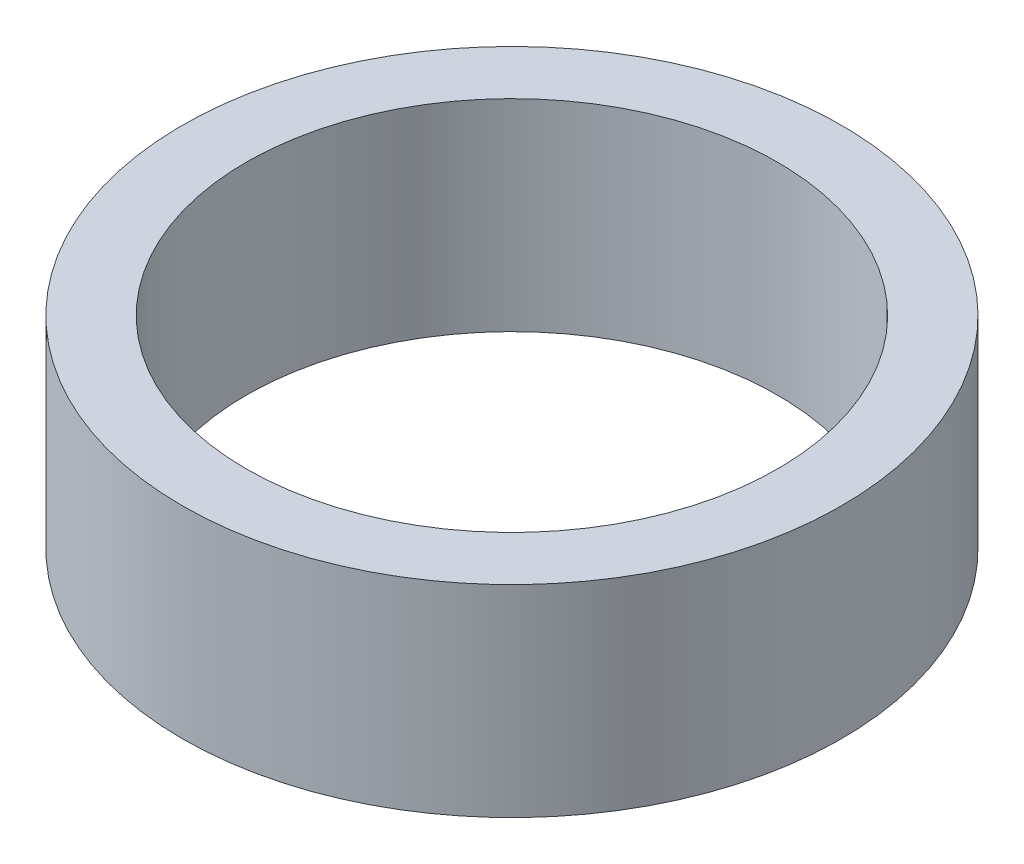
ISO-10303-21;
HEADER;
FILE_DESCRIPTION(('STEP AP214'),'2;1');
FILE_NAME('part.step','',(''),(''),'','','');
FILE_SCHEMA(('AUTOMOTIVE_DESIGN { 1 0 10303 214 1 1 1 1 }'));
ENDSEC;
DATA;
#1=APPLICATION_CONTEXT('core data for automotive mechanical design processes');
#2=APPLICATION_PROTOCOL_DEFINITION('international standard','automotive_design',2000,#1);
#3=PRODUCT_CONTEXT('',#1,'mechanical');
#4=PRODUCT('Part','Part','',(#3));
#5=PRODUCT_RELATED_PRODUCT_CATEGORY('part','',(#4));
#6=PRODUCT_DEFINITION_FORMATION('','',#4);
#7=PRODUCT_DEFINITION_CONTEXT('part definition',#1,'design');
#8=PRODUCT_DEFINITION('design','',#6,#7);
#9=PRODUCT_DEFINITION_SHAPE('','',#8);
#10=(LENGTH_UNIT() NAMED_UNIT(*) SI_UNIT(.MILLI.,.METRE.));
#11=(NAMED_UNIT(*) PLANE_ANGLE_UNIT() SI_UNIT($,.RADIAN.));
#12=(NAMED_UNIT(*) SI_UNIT($,.STERADIAN.) SOLID_ANGLE_UNIT());
#13=UNCERTAINTY_MEASURE_WITH_UNIT(LENGTH_MEASURE(1.E-05),#10,'distance_accuracy_value','');
#14=(GEOMETRIC_REPRESENTATION_CONTEXT(3) GLOBAL_UNCERTAINTY_ASSIGNED_CONTEXT((#13)) GLOBAL_UNIT_ASSIGNED_CONTEXT((#10,
#11,#12)) REPRESENTATION_CONTEXT('',''));
#15=CARTESIAN_POINT('',(0.,0.,0.));
#16=DIRECTION('',(0.,0.,1.));
#17=DIRECTION('',(1.,0.,0.));
#18=AXIS2_PLACEMENT_3D('',#15,#16,#17);
#19=CARTESIAN_POINT('',(0.,3.,0.));
#20=DIRECTION('',(0.,1.,0.));
#21=DIRECTION('',(0.,0.,1.));
#22=AXIS2_PLACEMENT_3D('',#19,#20,#21);
#23=PLANE('',#22);
#24=CARTESIAN_POINT('',(0.,3.,0.));
#25=DIRECTION('',(0.,1.,0.));
#26=DIRECTION('',(0.,0.,1.));
#27=AXIS2_PLACEMENT_3D('',#24,#25,#26);
#28=CIRCLE('',#27,4.9);
#29=CARTESIAN_POINT('',(0.,3.,4.9));
#30=VERTEX_POINT('',#29);
#31=EDGE_CURVE('E10',#30,#30,#28,.T.);
#32=ORIENTED_EDGE('',*,*,#31,.T.);
#33=EDGE_LOOP('',(#32));
#34=FACE_BOUND('',#33,.T.);
#35=CARTESIAN_POINT('',(0.,3.,0.));
#36=DIRECTION('',(0.,1.,0.));
#37=DIRECTION('',(0.,0.,1.));
#38=AXIS2_PLACEMENT_3D('',#35,#36,#37);
#39=CIRCLE('',#38,3.95);
#40=CARTESIAN_POINT('',(0.,3.,3.95));
#41=VERTEX_POINT('',#40);
#42=EDGE_CURVE('E54',#41,#41,#39,.T.);
#43=ORIENTED_EDGE('',*,*,#42,.F.);
#44=EDGE_LOOP('',(#43));
#45=FACE_BOUND('',#44,.T.);
#46=ADVANCED_FACE('F41',(#34,#45),#23,.T.);
#47=CARTESIAN_POINT('',(0.,0.,0.));
#48=DIRECTION('',(0.,1.,0.));
#49=DIRECTION('',(0.,0.,1.));
#50=AXIS2_PLACEMENT_3D('',#47,#48,#49);
#51=PLANE('',#50);
#52=CARTESIAN_POINT('',(0.,0.,0.));
#53=DIRECTION('',(0.,1.,0.));
#54=DIRECTION('',(0.,0.,1.));
#55=AXIS2_PLACEMENT_3D('',#52,#53,#54);
#56=CIRCLE('',#55,4.9);
#57=CARTESIAN_POINT('',(0.,0.,4.9));
#58=VERTEX_POINT('',#57);
#59=EDGE_CURVE('E45',#58,#58,#56,.T.);
#60=ORIENTED_EDGE('',*,*,#59,.F.);
#61=EDGE_LOOP('',(#60));
#62=FACE_BOUND('',#61,.T.);
#63=CARTESIAN_POINT('',(0.,0.,0.));
#64=DIRECTION('',(0.,1.,0.));
#65=DIRECTION('',(0.,0.,1.));
#66=AXIS2_PLACEMENT_3D('',#63,#64,#65);
#67=CIRCLE('',#66,3.95);
#68=CARTESIAN_POINT('',(0.,0.,3.95));
#69=VERTEX_POINT('',#68);
#70=EDGE_CURVE('E56',#69,#69,#67,.T.);
#71=ORIENTED_EDGE('',*,*,#70,.T.);
#72=EDGE_LOOP('',(#71));
#73=FACE_BOUND('',#72,.T.);
#74=ADVANCED_FACE('F68',(#62,#73),#51,.F.);
#75=CARTESIAN_POINT('',(0.,3.,0.));
#76=DIRECTION('',(0.,-1.,0.));
#77=DIRECTION('',(0.,0.,-1.));
#78=AXIS2_PLACEMENT_3D('',#75,#76,#77);
#79=CYLINDRICAL_SURFACE('',#78,4.9);
#80=ORIENTED_EDGE('',*,*,#31,.F.);
#81=EDGE_LOOP('',(#80));
#82=FACE_BOUND('',#81,.T.);
#83=ORIENTED_EDGE('',*,*,#59,.T.);
#84=EDGE_LOOP('',(#83));
#85=FACE_BOUND('',#84,.T.);
#86=ADVANCED_FACE('F43',(#82,#85),#79,.T.);
#87=CARTESIAN_POINT('',(0.,3.,0.));
#88=DIRECTION('',(0.,-1.,0.));
#89=DIRECTION('',(0.,0.,-1.));
#90=AXIS2_PLACEMENT_3D('',#87,#88,#89);
#91=CYLINDRICAL_SURFACE('',#90,3.95);
#92=ORIENTED_EDGE('',*,*,#42,.T.);
#93=EDGE_LOOP('',(#92));
#94=FACE_BOUND('',#93,.T.);
#95=ORIENTED_EDGE('',*,*,#70,.F.);
#96=EDGE_LOOP('',(#95));
#97=FACE_BOUND('',#96,.T.);
#98=ADVANCED_FACE('F64',(#94,#97),#91,.F.);
#99=CLOSED_SHELL('',(#46,#74,#86,#98));
#100=MANIFOLD_SOLID_BREP('B2',#99);
#101=ADVANCED_BREP_SHAPE_REPRESENTATION('',(#18,#100),#14);
#102=SHAPE_DEFINITION_REPRESENTATION(#9,#101);
ENDSEC;
END-ISO-10303-21;
